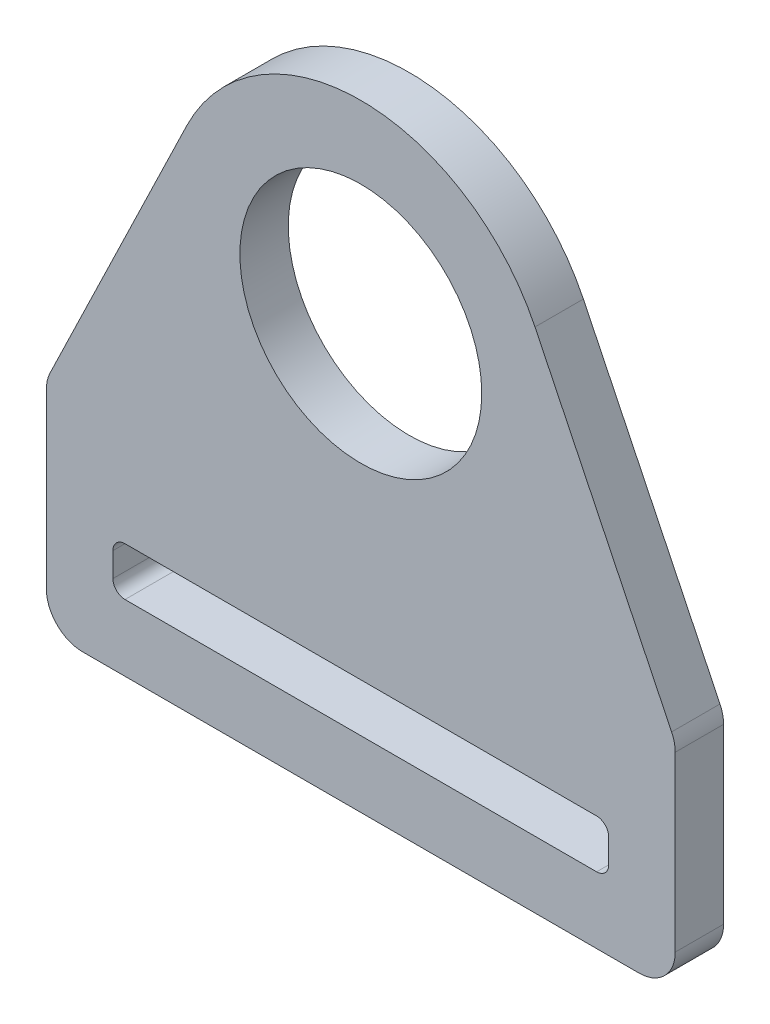
ISO-10303-21;
HEADER;
FILE_DESCRIPTION(('STEP AP214'),'2;1');
FILE_NAME('part.step','',(''),(''),'','','');
FILE_SCHEMA(('AUTOMOTIVE_DESIGN { 1 0 10303 214 1 1 1 1 }'));
ENDSEC;
DATA;
#1=APPLICATION_CONTEXT('core data for automotive mechanical design processes');
#2=APPLICATION_PROTOCOL_DEFINITION('international standard','automotive_design',2000,#1);
#3=PRODUCT_CONTEXT('',#1,'mechanical');
#4=PRODUCT('Part','Part','',(#3));
#5=PRODUCT_RELATED_PRODUCT_CATEGORY('part','',(#4));
#6=PRODUCT_DEFINITION_FORMATION('','',#4);
#7=PRODUCT_DEFINITION_CONTEXT('part definition',#1,'design');
#8=PRODUCT_DEFINITION('design','',#6,#7);
#9=PRODUCT_DEFINITION_SHAPE('','',#8);
#10=(LENGTH_UNIT() NAMED_UNIT(*) SI_UNIT(.MILLI.,.METRE.));
#11=(NAMED_UNIT(*) PLANE_ANGLE_UNIT() SI_UNIT($,.RADIAN.));
#12=(NAMED_UNIT(*) SI_UNIT($,.STERADIAN.) SOLID_ANGLE_UNIT());
#13=UNCERTAINTY_MEASURE_WITH_UNIT(LENGTH_MEASURE(1.E-05),#10,'distance_accuracy_value','');
#14=(GEOMETRIC_REPRESENTATION_CONTEXT(3) GLOBAL_UNCERTAINTY_ASSIGNED_CONTEXT((#13)) GLOBAL_UNIT_ASSIGNED_CONTEXT((#10,
#11,#12)) REPRESENTATION_CONTEXT('',''));
#15=CARTESIAN_POINT('',(0.,0.,0.));
#16=DIRECTION('',(0.,0.,1.));
#17=DIRECTION('',(1.,0.,0.));
#18=AXIS2_PLACEMENT_3D('',#15,#16,#17);
#19=CARTESIAN_POINT('',(0.,-25.5,4.));
#20=DIRECTION('',(0.,1.,0.));
#21=DIRECTION('',(0.,0.,1.));
#22=AXIS2_PLACEMENT_3D('',#19,#20,#21);
#23=PLANE('',#22);
#24=DIRECTION('',(1.,0.,0.));
#25=VECTOR('',#24,1.);
#26=CARTESIAN_POINT('',(0.,-25.5,0.));
#27=LINE('',#26,#25);
#28=CARTESIAN_POINT('',(-19.5,-25.5,0.));
#29=VERTEX_POINT('',#28);
#30=CARTESIAN_POINT('',(19.5,-25.5,0.));
#31=VERTEX_POINT('',#30);
#32=EDGE_CURVE('E233',#29,#31,#27,.T.);
#33=ORIENTED_EDGE('',*,*,#32,.T.);
#34=DIRECTION('',(0.,0.,-1.));
#35=VECTOR('',#34,1.);
#36=CARTESIAN_POINT('',(19.5,-25.5,4.));
#37=LINE('',#36,#35);
#38=CARTESIAN_POINT('',(19.5,-25.5,4.));
#39=VERTEX_POINT('',#38);
#40=EDGE_CURVE('E329',#31,#39,#37,.F.);
#41=ORIENTED_EDGE('',*,*,#40,.T.);
#42=DIRECTION('',(1.,0.,0.));
#43=VECTOR('',#42,1.);
#44=CARTESIAN_POINT('',(0.,-25.5,4.));
#45=LINE('',#44,#43);
#46=CARTESIAN_POINT('',(-19.5,-25.5,4.));
#47=VERTEX_POINT('',#46);
#48=EDGE_CURVE('E204',#47,#39,#45,.T.);
#49=ORIENTED_EDGE('',*,*,#48,.F.);
#50=DIRECTION('',(0.,0.,-1.));
#51=VECTOR('',#50,1.);
#52=CARTESIAN_POINT('',(-19.5,-25.5,4.));
#53=LINE('',#52,#51);
#54=EDGE_CURVE('E326',#47,#29,#53,.T.);
#55=ORIENTED_EDGE('',*,*,#54,.T.);
#56=EDGE_LOOP('',(#33,#41,#49,#55));
#57=FACE_BOUND('',#56,.T.);
#58=ADVANCED_FACE('F42',(#57),#23,.F.);
#59=CARTESIAN_POINT('',(20.5,0.,4.));
#60=DIRECTION('',(1.,0.,0.));
#61=DIRECTION('',(0.,0.,-1.));
#62=AXIS2_PLACEMENT_3D('',#59,#60,#61);
#63=PLANE('',#62);
#64=DIRECTION('',(0.,-1.,0.));
#65=VECTOR('',#64,1.);
#66=CARTESIAN_POINT('',(20.5,0.,0.));
#67=LINE('',#66,#65);
#68=CARTESIAN_POINT('',(20.5,-26.5,0.));
#69=VERTEX_POINT('',#68);
#70=CARTESIAN_POINT('',(20.5,-28.5,0.));
#71=VERTEX_POINT('',#70);
#72=EDGE_CURVE('E239',#69,#71,#67,.T.);
#73=ORIENTED_EDGE('',*,*,#72,.T.);
#74=DIRECTION('',(0.,0.,-1.));
#75=VECTOR('',#74,1.);
#76=CARTESIAN_POINT('',(20.5,-28.5,4.));
#77=LINE('',#76,#75);
#78=CARTESIAN_POINT('',(20.5,-28.5,4.));
#79=VERTEX_POINT('',#78);
#80=EDGE_CURVE('E324',#71,#79,#77,.F.);
#81=ORIENTED_EDGE('',*,*,#80,.T.);
#82=DIRECTION('',(0.,-1.,0.));
#83=VECTOR('',#82,1.);
#84=CARTESIAN_POINT('',(20.5,0.,4.));
#85=LINE('',#84,#83);
#86=CARTESIAN_POINT('',(20.5,-26.5,4.));
#87=VERTEX_POINT('',#86);
#88=EDGE_CURVE('E207',#87,#79,#85,.T.);
#89=ORIENTED_EDGE('',*,*,#88,.F.);
#90=DIRECTION('',(0.,0.,-1.));
#91=VECTOR('',#90,1.);
#92=CARTESIAN_POINT('',(20.5,-26.5,0.));
#93=LINE('',#92,#91);
#94=EDGE_CURVE('E321',#87,#69,#93,.T.);
#95=ORIENTED_EDGE('',*,*,#94,.T.);
#96=EDGE_LOOP('',(#73,#81,#89,#95));
#97=FACE_BOUND('',#96,.T.);
#98=ADVANCED_FACE('F353',(#97),#63,.F.);
#99=CARTESIAN_POINT('',(0.,-29.5,4.));
#100=DIRECTION('',(0.,1.,0.));
#101=DIRECTION('',(0.,0.,1.));
#102=AXIS2_PLACEMENT_3D('',#99,#100,#101);
#103=PLANE('',#102);
#104=DIRECTION('',(1.,0.,0.));
#105=VECTOR('',#104,1.);
#106=CARTESIAN_POINT('',(0.,-29.5,4.));
#107=LINE('',#106,#105);
#108=CARTESIAN_POINT('',(-19.5,-29.5,4.));
#109=VERTEX_POINT('',#108);
#110=CARTESIAN_POINT('',(19.5,-29.5,4.));
#111=VERTEX_POINT('',#110);
#112=EDGE_CURVE('E210',#109,#111,#107,.T.);
#113=ORIENTED_EDGE('',*,*,#112,.T.);
#114=DIRECTION('',(0.,0.,-1.));
#115=VECTOR('',#114,1.);
#116=CARTESIAN_POINT('',(19.5,-29.5,4.));
#117=LINE('',#116,#115);
#118=CARTESIAN_POINT('',(19.5,-29.5,0.));
#119=VERTEX_POINT('',#118);
#120=EDGE_CURVE('E318',#111,#119,#117,.T.);
#121=ORIENTED_EDGE('',*,*,#120,.T.);
#122=DIRECTION('',(1.,0.,0.));
#123=VECTOR('',#122,1.);
#124=CARTESIAN_POINT('',(0.,-29.5,0.));
#125=LINE('',#124,#123);
#126=CARTESIAN_POINT('',(-19.5,-29.5,0.));
#127=VERTEX_POINT('',#126);
#128=EDGE_CURVE('E247',#127,#119,#125,.T.);
#129=ORIENTED_EDGE('',*,*,#128,.F.);
#130=DIRECTION('',(0.,0.,-1.));
#131=VECTOR('',#130,1.);
#132=CARTESIAN_POINT('',(-19.5,-29.5,4.));
#133=LINE('',#132,#131);
#134=EDGE_CURVE('E316',#127,#109,#133,.F.);
#135=ORIENTED_EDGE('',*,*,#134,.T.);
#136=EDGE_LOOP('',(#113,#121,#129,#135));
#137=FACE_BOUND('',#136,.T.);
#138=ADVANCED_FACE('F348',(#137),#103,.T.);
#139=CARTESIAN_POINT('',(0.,-35.,4.));
#140=DIRECTION('',(0.,1.,0.));
#141=DIRECTION('',(0.,0.,1.));
#142=AXIS2_PLACEMENT_3D('',#139,#140,#141);
#143=PLANE('',#142);
#144=DIRECTION('',(1.,0.,0.));
#145=VECTOR('',#144,1.);
#146=CARTESIAN_POINT('',(0.,-35.,4.));
#147=LINE('',#146,#145);
#148=CARTESIAN_POINT('',(-23.,-35.,4.));
#149=VERTEX_POINT('',#148);
#150=CARTESIAN_POINT('',(23.,-35.,4.));
#151=VERTEX_POINT('',#150);
#152=EDGE_CURVE('E277',#149,#151,#147,.T.);
#153=ORIENTED_EDGE('',*,*,#152,.F.);
#154=DIRECTION('',(0.,0.,-1.));
#155=VECTOR('',#154,1.);
#156=CARTESIAN_POINT('',(-23.,-35.,0.));
#157=LINE('',#156,#155);
#158=CARTESIAN_POINT('',(-23.,-35.,0.));
#159=VERTEX_POINT('',#158);
#160=EDGE_CURVE('E306',#149,#159,#157,.T.);
#161=ORIENTED_EDGE('',*,*,#160,.T.);
#162=DIRECTION('',(1.,0.,0.));
#163=VECTOR('',#162,1.);
#164=CARTESIAN_POINT('',(0.,-35.,0.));
#165=LINE('',#164,#163);
#166=CARTESIAN_POINT('',(23.,-35.,0.));
#167=VERTEX_POINT('',#166);
#168=EDGE_CURVE('E218',#159,#167,#165,.T.);
#169=ORIENTED_EDGE('',*,*,#168,.T.);
#170=DIRECTION('',(0.,0.,-1.));
#171=VECTOR('',#170,1.);
#172=CARTESIAN_POINT('',(23.,-35.,4.));
#173=LINE('',#172,#171);
#174=EDGE_CURVE('E304',#167,#151,#173,.F.);
#175=ORIENTED_EDGE('',*,*,#174,.T.);
#176=EDGE_LOOP('',(#153,#161,#169,#175));
#177=FACE_BOUND('',#176,.T.);
#178=ADVANCED_FACE('F402',(#177),#143,.F.);
#179=CARTESIAN_POINT('',(26.,0.,4.));
#180=DIRECTION('',(-1.,0.,0.));
#181=DIRECTION('',(0.,-1.,0.));
#182=AXIS2_PLACEMENT_3D('',#179,#180,#181);
#183=PLANE('',#182);
#184=DIRECTION('',(0.,1.,0.));
#185=VECTOR('',#184,1.);
#186=CARTESIAN_POINT('',(26.,0.,0.));
#187=LINE('',#186,#185);
#188=CARTESIAN_POINT('',(26.,-32.,0.));
#189=VERTEX_POINT('',#188);
#190=CARTESIAN_POINT('',(26.,-17.6876467079563,0.));
#191=VERTEX_POINT('',#190);
#192=EDGE_CURVE('E223',#189,#191,#187,.T.);
#193=ORIENTED_EDGE('',*,*,#192,.T.);
#194=DIRECTION('',(0.,0.,-1.));
#195=VECTOR('',#194,1.);
#196=CARTESIAN_POINT('',(26.,-17.6876467079563,4.));
#197=LINE('',#196,#195);
#198=CARTESIAN_POINT('',(26.,-17.6876467079563,4.));
#199=VERTEX_POINT('',#198);
#200=EDGE_CURVE('E314',#191,#199,#197,.F.);
#201=ORIENTED_EDGE('',*,*,#200,.T.);
#202=DIRECTION('',(0.,1.,0.));
#203=VECTOR('',#202,1.);
#204=CARTESIAN_POINT('',(26.,0.,4.));
#205=LINE('',#204,#203);
#206=CARTESIAN_POINT('',(26.,-32.,4.));
#207=VERTEX_POINT('',#206);
#208=EDGE_CURVE('E181',#207,#199,#205,.T.);
#209=ORIENTED_EDGE('',*,*,#208,.F.);
#210=DIRECTION('',(0.,0.,-1.));
#211=VECTOR('',#210,1.);
#212=CARTESIAN_POINT('',(26.,-32.,4.));
#213=LINE('',#212,#211);
#214=EDGE_CURVE('E311',#207,#189,#213,.T.);
#215=ORIENTED_EDGE('',*,*,#214,.T.);
#216=EDGE_LOOP('',(#193,#201,#209,#215));
#217=FACE_BOUND('',#216,.T.);
#218=ADVANCED_FACE('F399',(#217),#183,.F.);
#219=CARTESIAN_POINT('',(14.402651465179,6.9687610643914,4.));
#220=DIRECTION('',(-0.900165716573687,-0.435547566524462,0.));
#221=DIRECTION('',(0.435547566524462,-0.900165716573687,0.));
#222=AXIS2_PLACEMENT_3D('',#219,#220,#221);
#223=PLANE('',#222);
#224=DIRECTION('',(-0.435547566524462,0.900165716573687,0.));
#225=VECTOR('',#224,1.);
#226=CARTESIAN_POINT('',(14.402651465179,6.9687610643914,4.));
#227=LINE('',#226,#225);
#228=CARTESIAN_POINT('',(25.7004971497211,-16.381004008383,4.));
#229=VERTEX_POINT('',#228);
#230=CARTESIAN_POINT('',(14.402651465179,6.9687610643914,4.));
#231=VERTEX_POINT('',#230);
#232=EDGE_CURVE('E168',#229,#231,#227,.T.);
#233=ORIENTED_EDGE('',*,*,#232,.F.);
#234=DIRECTION('',(0.,0.,-1.));
#235=VECTOR('',#234,1.);
#236=CARTESIAN_POINT('',(25.7004971497211,-16.381004008383,4.));
#237=LINE('',#236,#235);
#238=CARTESIAN_POINT('',(25.7004971497211,-16.381004008383,0.));
#239=VERTEX_POINT('',#238);
#240=EDGE_CURVE('E309',#229,#239,#237,.T.);
#241=ORIENTED_EDGE('',*,*,#240,.T.);
#242=DIRECTION('',(-0.435547566524462,0.900165716573687,0.));
#243=VECTOR('',#242,1.);
#244=CARTESIAN_POINT('',(14.402651465179,6.9687610643914,0.));
#245=LINE('',#244,#243);
#246=CARTESIAN_POINT('',(14.402651465179,6.9687610643914,0.));
#247=VERTEX_POINT('',#246);
#248=EDGE_CURVE('E187',#239,#247,#245,.T.);
#249=ORIENTED_EDGE('',*,*,#248,.T.);
#250=DIRECTION('',(0.,0.,-1.));
#251=VECTOR('',#250,1.);
#252=CARTESIAN_POINT('',(14.402651465179,6.9687610643914,4.));
#253=LINE('',#252,#251);
#254=EDGE_CURVE('E184',#231,#247,#253,.T.);
#255=ORIENTED_EDGE('',*,*,#254,.F.);
#256=EDGE_LOOP('',(#233,#241,#249,#255));
#257=FACE_BOUND('',#256,.T.);
#258=ADVANCED_FACE('F185',(#257),#223,.F.);
#259=CARTESIAN_POINT('',(0.,0.,4.));
#260=DIRECTION('',(0.,0.,-1.));
#261=DIRECTION('',(-1.,0.,0.));
#262=AXIS2_PLACEMENT_3D('',#259,#260,#261);
#263=CYLINDRICAL_SURFACE('',#262,16.);
#264=CARTESIAN_POINT('',(0.,0.,0.));
#265=DIRECTION('',(0.,0.,1.));
#266=DIRECTION('',(1.,0.,0.));
#267=AXIS2_PLACEMENT_3D('',#264,#265,#266);
#268=CIRCLE('',#267,16.);
#269=CARTESIAN_POINT('',(-14.402651465179,6.96876106439139,0.));
#270=VERTEX_POINT('',#269);
#271=EDGE_CURVE('E569',#247,#270,#268,.T.);
#272=ORIENTED_EDGE('',*,*,#271,.T.);
#273=DIRECTION('',(0.,0.,-1.));
#274=VECTOR('',#273,1.);
#275=CARTESIAN_POINT('',(-14.402651465179,6.96876106439139,4.));
#276=LINE('',#275,#274);
#277=CARTESIAN_POINT('',(-14.402651465179,6.96876106439139,4.));
#278=VERTEX_POINT('',#277);
#279=EDGE_CURVE('E192',#278,#270,#276,.T.);
#280=ORIENTED_EDGE('',*,*,#279,.F.);
#281=CARTESIAN_POINT('',(0.,0.,4.));
#282=DIRECTION('',(0.,0.,1.));
#283=DIRECTION('',(1.,0.,0.));
#284=AXIS2_PLACEMENT_3D('',#281,#282,#283);
#285=CIRCLE('',#284,16.);
#286=EDGE_CURVE('E173',#231,#278,#285,.T.);
#287=ORIENTED_EDGE('',*,*,#286,.F.);
#288=ORIENTED_EDGE('',*,*,#254,.T.);
#289=EDGE_LOOP('',(#272,#280,#287,#288));
#290=FACE_BOUND('',#289,.T.);
#291=ADVANCED_FACE('F194',(#290),#263,.T.);
#292=CARTESIAN_POINT('',(-14.402651465179,6.96876106439139,4.));
#293=DIRECTION('',(-0.900165716573687,0.435547566524462,0.));
#294=DIRECTION('',(-0.435547566524462,-0.900165716573687,0.));
#295=AXIS2_PLACEMENT_3D('',#292,#293,#294);
#296=PLANE('',#295);
#297=DIRECTION('',(0.435547566524462,0.900165716573687,0.));
#298=VECTOR('',#297,1.);
#299=CARTESIAN_POINT('',(-14.402651465179,6.96876106439139,0.));
#300=LINE('',#299,#298);
#301=CARTESIAN_POINT('',(-25.7004971497211,-16.381004008383,0.));
#302=VERTEX_POINT('',#301);
#303=EDGE_CURVE('E567',#302,#270,#300,.T.);
#304=ORIENTED_EDGE('',*,*,#303,.F.);
#305=DIRECTION('',(0.,0.,-1.));
#306=VECTOR('',#305,1.);
#307=CARTESIAN_POINT('',(-25.7004971497211,-16.3810040083829,4.));
#308=LINE('',#307,#306);
#309=CARTESIAN_POINT('',(-25.7004971497211,-16.381004008383,4.));
#310=VERTEX_POINT('',#309);
#311=EDGE_CURVE('E295',#302,#310,#308,.F.);
#312=ORIENTED_EDGE('',*,*,#311,.T.);
#313=DIRECTION('',(0.435547566524462,0.900165716573687,0.));
#314=VECTOR('',#313,1.);
#315=CARTESIAN_POINT('',(-14.402651465179,6.96876106439139,4.));
#316=LINE('',#315,#314);
#317=EDGE_CURVE('E196',#310,#278,#316,.T.);
#318=ORIENTED_EDGE('',*,*,#317,.T.);
#319=ORIENTED_EDGE('',*,*,#279,.T.);
#320=EDGE_LOOP('',(#304,#312,#318,#319));
#321=FACE_BOUND('',#320,.T.);
#322=ADVANCED_FACE('F375',(#321),#296,.T.);
#323=CARTESIAN_POINT('',(-20.5,0.,4.));
#324=DIRECTION('',(1.,0.,0.));
#325=DIRECTION('',(0.,0.,-1.));
#326=AXIS2_PLACEMENT_3D('',#323,#324,#325);
#327=PLANE('',#326);
#328=DIRECTION('',(0.,-1.,0.));
#329=VECTOR('',#328,1.);
#330=CARTESIAN_POINT('',(-20.5,0.,4.));
#331=LINE('',#330,#329);
#332=CARTESIAN_POINT('',(-20.5,-26.5,4.));
#333=VERTEX_POINT('',#332);
#334=CARTESIAN_POINT('',(-20.5,-28.5,4.));
#335=VERTEX_POINT('',#334);
#336=EDGE_CURVE('E213',#333,#335,#331,.T.);
#337=ORIENTED_EDGE('',*,*,#336,.T.);
#338=DIRECTION('',(0.,0.,-1.));
#339=VECTOR('',#338,1.);
#340=CARTESIAN_POINT('',(-20.5,-28.5,0.));
#341=LINE('',#340,#339);
#342=CARTESIAN_POINT('',(-20.5,-28.5,0.));
#343=VERTEX_POINT('',#342);
#344=EDGE_CURVE('E332',#335,#343,#341,.T.);
#345=ORIENTED_EDGE('',*,*,#344,.T.);
#346=DIRECTION('',(0.,-1.,0.));
#347=VECTOR('',#346,1.);
#348=CARTESIAN_POINT('',(-20.5,0.,0.));
#349=LINE('',#348,#347);
#350=CARTESIAN_POINT('',(-20.5,-26.5,0.));
#351=VERTEX_POINT('',#350);
#352=EDGE_CURVE('E268',#351,#343,#349,.T.);
#353=ORIENTED_EDGE('',*,*,#352,.F.);
#354=DIRECTION('',(0.,0.,-1.));
#355=VECTOR('',#354,1.);
#356=CARTESIAN_POINT('',(-20.5,-26.5,4.));
#357=LINE('',#356,#355);
#358=EDGE_CURVE('E64',#351,#333,#357,.F.);
#359=ORIENTED_EDGE('',*,*,#358,.T.);
#360=EDGE_LOOP('',(#337,#345,#353,#359));
#361=FACE_BOUND('',#360,.T.);
#362=ADVANCED_FACE('F372',(#361),#327,.T.);
#363=CARTESIAN_POINT('',(-26.,0.,4.));
#364=DIRECTION('',(-1.,0.,0.));
#365=DIRECTION('',(0.,-1.,0.));
#366=AXIS2_PLACEMENT_3D('',#363,#364,#365);
#367=PLANE('',#366);
#368=DIRECTION('',(0.,1.,0.));
#369=VECTOR('',#368,1.);
#370=CARTESIAN_POINT('',(-26.,0.,4.));
#371=LINE('',#370,#369);
#372=CARTESIAN_POINT('',(-26.,-32.,4.));
#373=VERTEX_POINT('',#372);
#374=CARTESIAN_POINT('',(-26.,-17.6876467079563,4.));
#375=VERTEX_POINT('',#374);
#376=EDGE_CURVE('E198',#373,#375,#371,.T.);
#377=ORIENTED_EDGE('',*,*,#376,.T.);
#378=DIRECTION('',(0.,0.,-1.));
#379=VECTOR('',#378,1.);
#380=CARTESIAN_POINT('',(-26.,-17.6876467079563,4.));
#381=LINE('',#380,#379);
#382=CARTESIAN_POINT('',(-26.,-17.6876467079563,0.));
#383=VERTEX_POINT('',#382);
#384=EDGE_CURVE('E280',#375,#383,#381,.T.);
#385=ORIENTED_EDGE('',*,*,#384,.T.);
#386=DIRECTION('',(0.,1.,0.));
#387=VECTOR('',#386,1.);
#388=CARTESIAN_POINT('',(-26.,0.,0.));
#389=LINE('',#388,#387);
#390=CARTESIAN_POINT('',(-26.,-32.,0.));
#391=VERTEX_POINT('',#390);
#392=EDGE_CURVE('E240',#391,#383,#389,.T.);
#393=ORIENTED_EDGE('',*,*,#392,.F.);
#394=DIRECTION('',(0.,0.,-1.));
#395=VECTOR('',#394,1.);
#396=CARTESIAN_POINT('',(-26.,-32.,4.));
#397=LINE('',#396,#395);
#398=EDGE_CURVE('E191',#391,#373,#397,.F.);
#399=ORIENTED_EDGE('',*,*,#398,.T.);
#400=EDGE_LOOP('',(#377,#385,#393,#399));
#401=FACE_BOUND('',#400,.T.);
#402=ADVANCED_FACE('F374',(#401),#367,.T.);
#403=CARTESIAN_POINT('',(0.,0.,4.));
#404=DIRECTION('',(0.,0.,-1.));
#405=DIRECTION('',(-1.,0.,0.));
#406=AXIS2_PLACEMENT_3D('',#403,#404,#405);
#407=CYLINDRICAL_SURFACE('',#406,10.);
#408=CARTESIAN_POINT('',(0.,0.,4.));
#409=DIRECTION('',(0.,0.,1.));
#410=DIRECTION('',(1.,0.,0.));
#411=AXIS2_PLACEMENT_3D('',#408,#409,#410);
#412=CIRCLE('',#411,10.);
#413=CARTESIAN_POINT('',(10.,0.,4.));
#414=VERTEX_POINT('',#413);
#415=EDGE_CURVE('E215',#414,#414,#412,.T.);
#416=ORIENTED_EDGE('',*,*,#415,.T.);
#417=EDGE_LOOP('',(#416));
#418=FACE_BOUND('',#417,.T.);
#419=CARTESIAN_POINT('',(0.,0.,0.));
#420=DIRECTION('',(0.,0.,1.));
#421=DIRECTION('',(1.,0.,0.));
#422=AXIS2_PLACEMENT_3D('',#419,#420,#421);
#423=CIRCLE('',#422,10.);
#424=CARTESIAN_POINT('',(10.,0.,0.));
#425=VERTEX_POINT('',#424);
#426=EDGE_CURVE('E272',#425,#425,#423,.T.);
#427=ORIENTED_EDGE('',*,*,#426,.F.);
#428=EDGE_LOOP('',(#427));
#429=FACE_BOUND('',#428,.T.);
#430=ADVANCED_FACE('F381',(#418,#429),#407,.F.);
#431=CARTESIAN_POINT('',(0.,0.,4.));
#432=DIRECTION('',(0.,0.,1.));
#433=DIRECTION('',(1.,0.,0.));
#434=AXIS2_PLACEMENT_3D('',#431,#432,#433);
#435=PLANE('',#434);
#436=ORIENTED_EDGE('',*,*,#317,.F.);
#437=CARTESIAN_POINT('',(-23.,-17.6876467079563,4.));
#438=DIRECTION('',(0.,0.,1.));
#439=DIRECTION('',(1.,0.,0.));
#440=AXIS2_PLACEMENT_3D('',#437,#438,#439);
#441=CIRCLE('',#440,3.);
#442=EDGE_CURVE('E302',#310,#375,#441,.T.);
#443=ORIENTED_EDGE('',*,*,#442,.T.);
#444=ORIENTED_EDGE('',*,*,#376,.F.);
#445=CARTESIAN_POINT('',(-23.,-32.,4.));
#446=DIRECTION('',(0.,0.,1.));
#447=DIRECTION('',(1.,0.,0.));
#448=AXIS2_PLACEMENT_3D('',#445,#446,#447);
#449=CIRCLE('',#448,3.);
#450=EDGE_CURVE('E300',#373,#149,#449,.T.);
#451=ORIENTED_EDGE('',*,*,#450,.T.);
#452=ORIENTED_EDGE('',*,*,#152,.T.);
#453=CARTESIAN_POINT('',(23.,-32.,4.));
#454=DIRECTION('',(0.,0.,1.));
#455=DIRECTION('',(1.,0.,0.));
#456=AXIS2_PLACEMENT_3D('',#453,#454,#455);
#457=CIRCLE('',#456,3.);
#458=EDGE_CURVE('E297',#151,#207,#457,.T.);
#459=ORIENTED_EDGE('',*,*,#458,.T.);
#460=ORIENTED_EDGE('',*,*,#208,.T.);
#461=CARTESIAN_POINT('',(23.,-17.6876467079563,4.));
#462=DIRECTION('',(0.,0.,1.));
#463=DIRECTION('',(1.,0.,0.));
#464=AXIS2_PLACEMENT_3D('',#461,#462,#463);
#465=CIRCLE('',#464,3.);
#466=EDGE_CURVE('E177',#199,#229,#465,.T.);
#467=ORIENTED_EDGE('',*,*,#466,.T.);
#468=ORIENTED_EDGE('',*,*,#232,.T.);
#469=ORIENTED_EDGE('',*,*,#286,.T.);
#470=EDGE_LOOP('',(#436,#443,#444,#451,#452,#459,#460,#467,#468,#469));
#471=FACE_BOUND('',#470,.T.);
#472=ORIENTED_EDGE('',*,*,#336,.F.);
#473=CARTESIAN_POINT('',(-19.5,-26.5,4.));
#474=DIRECTION('',(0.,0.,1.));
#475=DIRECTION('',(1.,0.,0.));
#476=AXIS2_PLACEMENT_3D('',#473,#474,#475);
#477=CIRCLE('',#476,1.);
#478=EDGE_CURVE('E12',#333,#47,#477,.F.);
#479=ORIENTED_EDGE('',*,*,#478,.T.);
#480=ORIENTED_EDGE('',*,*,#48,.T.);
#481=CARTESIAN_POINT('',(19.5,-26.5,4.));
#482=DIRECTION('',(0.,0.,1.));
#483=DIRECTION('',(1.,0.,0.));
#484=AXIS2_PLACEMENT_3D('',#481,#482,#483);
#485=CIRCLE('',#484,1.);
#486=EDGE_CURVE('E260',#39,#87,#485,.F.);
#487=ORIENTED_EDGE('',*,*,#486,.T.);
#488=ORIENTED_EDGE('',*,*,#88,.T.);
#489=CARTESIAN_POINT('',(19.5,-28.5,4.));
#490=DIRECTION('',(0.,0.,1.));
#491=DIRECTION('',(1.,0.,0.));
#492=AXIS2_PLACEMENT_3D('',#489,#490,#491);
#493=CIRCLE('',#492,1.);
#494=EDGE_CURVE('E261',#79,#111,#493,.F.);
#495=ORIENTED_EDGE('',*,*,#494,.T.);
#496=ORIENTED_EDGE('',*,*,#112,.F.);
#497=CARTESIAN_POINT('',(-19.5,-28.5,4.));
#498=DIRECTION('',(0.,0.,1.));
#499=DIRECTION('',(1.,0.,0.));
#500=AXIS2_PLACEMENT_3D('',#497,#498,#499);
#501=CIRCLE('',#500,1.);
#502=EDGE_CURVE('E57',#109,#335,#501,.F.);
#503=ORIENTED_EDGE('',*,*,#502,.T.);
#504=EDGE_LOOP('',(#472,#479,#480,#487,#488,#495,#496,#503));
#505=FACE_BOUND('',#504,.T.);
#506=ORIENTED_EDGE('',*,*,#415,.F.);
#507=EDGE_LOOP('',(#506));
#508=FACE_BOUND('',#507,.T.);
#509=ADVANCED_FACE('F171',(#471,#505,#508),#435,.T.);
#510=CARTESIAN_POINT('',(0.,0.,0.));
#511=DIRECTION('',(0.,0.,1.));
#512=DIRECTION('',(1.,0.,0.));
#513=AXIS2_PLACEMENT_3D('',#510,#511,#512);
#514=PLANE('',#513);
#515=ORIENTED_EDGE('',*,*,#392,.T.);
#516=CARTESIAN_POINT('',(-23.,-17.6876467079563,0.));
#517=DIRECTION('',(0.,0.,1.));
#518=DIRECTION('',(1.,0.,0.));
#519=AXIS2_PLACEMENT_3D('',#516,#517,#518);
#520=CIRCLE('',#519,3.);
#521=EDGE_CURVE('E292',#383,#302,#520,.F.);
#522=ORIENTED_EDGE('',*,*,#521,.T.);
#523=ORIENTED_EDGE('',*,*,#303,.T.);
#524=ORIENTED_EDGE('',*,*,#271,.F.);
#525=ORIENTED_EDGE('',*,*,#248,.F.);
#526=CARTESIAN_POINT('',(23.,-17.6876467079563,0.));
#527=DIRECTION('',(0.,0.,1.));
#528=DIRECTION('',(1.,0.,0.));
#529=AXIS2_PLACEMENT_3D('',#526,#527,#528);
#530=CIRCLE('',#529,3.);
#531=EDGE_CURVE('E286',#239,#191,#530,.F.);
#532=ORIENTED_EDGE('',*,*,#531,.T.);
#533=ORIENTED_EDGE('',*,*,#192,.F.);
#534=CARTESIAN_POINT('',(23.,-32.,0.));
#535=DIRECTION('',(0.,0.,1.));
#536=DIRECTION('',(1.,0.,0.));
#537=AXIS2_PLACEMENT_3D('',#534,#535,#536);
#538=CIRCLE('',#537,3.);
#539=EDGE_CURVE('E283',#189,#167,#538,.F.);
#540=ORIENTED_EDGE('',*,*,#539,.T.);
#541=ORIENTED_EDGE('',*,*,#168,.F.);
#542=CARTESIAN_POINT('',(-23.,-32.,0.));
#543=DIRECTION('',(0.,0.,1.));
#544=DIRECTION('',(1.,0.,0.));
#545=AXIS2_PLACEMENT_3D('',#542,#543,#544);
#546=CIRCLE('',#545,3.);
#547=EDGE_CURVE('E289',#159,#391,#546,.F.);
#548=ORIENTED_EDGE('',*,*,#547,.T.);
#549=EDGE_LOOP('',(#515,#522,#523,#524,#525,#532,#533,#540,#541,#548));
#550=FACE_BOUND('',#549,.T.);
#551=ORIENTED_EDGE('',*,*,#32,.F.);
#552=CARTESIAN_POINT('',(-19.5,-26.5,0.));
#553=DIRECTION('',(0.,0.,1.));
#554=DIRECTION('',(1.,0.,0.));
#555=AXIS2_PLACEMENT_3D('',#552,#553,#554);
#556=CIRCLE('',#555,1.);
#557=EDGE_CURVE('E50',#29,#351,#556,.T.);
#558=ORIENTED_EDGE('',*,*,#557,.T.);
#559=ORIENTED_EDGE('',*,*,#352,.T.);
#560=CARTESIAN_POINT('',(-19.5,-28.5,0.));
#561=DIRECTION('',(0.,0.,1.));
#562=DIRECTION('',(1.,0.,0.));
#563=AXIS2_PLACEMENT_3D('',#560,#561,#562);
#564=CIRCLE('',#563,1.);
#565=EDGE_CURVE('E263',#343,#127,#564,.T.);
#566=ORIENTED_EDGE('',*,*,#565,.T.);
#567=ORIENTED_EDGE('',*,*,#128,.T.);
#568=CARTESIAN_POINT('',(19.5,-28.5,0.));
#569=DIRECTION('',(0.,0.,1.));
#570=DIRECTION('',(1.,0.,0.));
#571=AXIS2_PLACEMENT_3D('',#568,#569,#570);
#572=CIRCLE('',#571,1.);
#573=EDGE_CURVE('E334',#119,#71,#572,.T.);
#574=ORIENTED_EDGE('',*,*,#573,.T.);
#575=ORIENTED_EDGE('',*,*,#72,.F.);
#576=CARTESIAN_POINT('',(19.5,-26.5,0.));
#577=DIRECTION('',(0.,0.,1.));
#578=DIRECTION('',(1.,0.,0.));
#579=AXIS2_PLACEMENT_3D('',#576,#577,#578);
#580=CIRCLE('',#579,1.);
#581=EDGE_CURVE('E255',#69,#31,#580,.T.);
#582=ORIENTED_EDGE('',*,*,#581,.T.);
#583=EDGE_LOOP('',(#551,#558,#559,#566,#567,#574,#575,#582));
#584=FACE_BOUND('',#583,.T.);
#585=ORIENTED_EDGE('',*,*,#426,.T.);
#586=EDGE_LOOP('',(#585));
#587=FACE_BOUND('',#586,.T.);
#588=ADVANCED_FACE('F356',(#550,#584,#587),#514,.F.);
#589=CARTESIAN_POINT('',(-23.,-17.6876467079563,4.));
#590=DIRECTION('',(0.,0.,-1.));
#591=DIRECTION('',(-1.,0.,0.));
#592=AXIS2_PLACEMENT_3D('',#589,#590,#591);
#593=CYLINDRICAL_SURFACE('',#592,3.);
#594=ORIENTED_EDGE('',*,*,#442,.F.);
#595=ORIENTED_EDGE('',*,*,#311,.F.);
#596=ORIENTED_EDGE('',*,*,#521,.F.);
#597=ORIENTED_EDGE('',*,*,#384,.F.);
#598=EDGE_LOOP('',(#594,#595,#596,#597));
#599=FACE_BOUND('',#598,.T.);
#600=ADVANCED_FACE('F407',(#599),#593,.T.);
#601=CARTESIAN_POINT('',(-23.,-32.,4.));
#602=DIRECTION('',(0.,0.,1.));
#603=DIRECTION('',(1.,0.,0.));
#604=AXIS2_PLACEMENT_3D('',#601,#602,#603);
#605=CYLINDRICAL_SURFACE('',#604,3.);
#606=ORIENTED_EDGE('',*,*,#450,.F.);
#607=ORIENTED_EDGE('',*,*,#398,.F.);
#608=ORIENTED_EDGE('',*,*,#547,.F.);
#609=ORIENTED_EDGE('',*,*,#160,.F.);
#610=EDGE_LOOP('',(#606,#607,#608,#609));
#611=FACE_BOUND('',#610,.T.);
#612=ADVANCED_FACE('F410',(#611),#605,.T.);
#613=CARTESIAN_POINT('',(23.,-17.6876467079563,4.));
#614=DIRECTION('',(0.,0.,-1.));
#615=DIRECTION('',(-1.,0.,0.));
#616=AXIS2_PLACEMENT_3D('',#613,#614,#615);
#617=CYLINDRICAL_SURFACE('',#616,3.);
#618=ORIENTED_EDGE('',*,*,#466,.F.);
#619=ORIENTED_EDGE('',*,*,#200,.F.);
#620=ORIENTED_EDGE('',*,*,#531,.F.);
#621=ORIENTED_EDGE('',*,*,#240,.F.);
#622=EDGE_LOOP('',(#618,#619,#620,#621));
#623=FACE_BOUND('',#622,.T.);
#624=ADVANCED_FACE('F414',(#623),#617,.T.);
#625=CARTESIAN_POINT('',(23.,-32.,4.));
#626=DIRECTION('',(0.,0.,-1.));
#627=DIRECTION('',(-1.,0.,0.));
#628=AXIS2_PLACEMENT_3D('',#625,#626,#627);
#629=CYLINDRICAL_SURFACE('',#628,3.);
#630=ORIENTED_EDGE('',*,*,#458,.F.);
#631=ORIENTED_EDGE('',*,*,#174,.F.);
#632=ORIENTED_EDGE('',*,*,#539,.F.);
#633=ORIENTED_EDGE('',*,*,#214,.F.);
#634=EDGE_LOOP('',(#630,#631,#632,#633));
#635=FACE_BOUND('',#634,.T.);
#636=ADVANCED_FACE('F418',(#635),#629,.T.);
#637=CARTESIAN_POINT('',(19.5,-28.5,4.));
#638=DIRECTION('',(0.,0.,-1.));
#639=DIRECTION('',(-1.,0.,0.));
#640=AXIS2_PLACEMENT_3D('',#637,#638,#639);
#641=CYLINDRICAL_SURFACE('',#640,1.);
#642=ORIENTED_EDGE('',*,*,#494,.F.);
#643=ORIENTED_EDGE('',*,*,#80,.F.);
#644=ORIENTED_EDGE('',*,*,#573,.F.);
#645=ORIENTED_EDGE('',*,*,#120,.F.);
#646=EDGE_LOOP('',(#642,#643,#644,#645));
#647=FACE_BOUND('',#646,.T.);
#648=ADVANCED_FACE('F351',(#647),#641,.F.);
#649=CARTESIAN_POINT('',(19.5,-26.5,4.));
#650=DIRECTION('',(0.,0.,1.));
#651=DIRECTION('',(1.,0.,0.));
#652=AXIS2_PLACEMENT_3D('',#649,#650,#651);
#653=CYLINDRICAL_SURFACE('',#652,1.);
#654=ORIENTED_EDGE('',*,*,#486,.F.);
#655=ORIENTED_EDGE('',*,*,#40,.F.);
#656=ORIENTED_EDGE('',*,*,#581,.F.);
#657=ORIENTED_EDGE('',*,*,#94,.F.);
#658=EDGE_LOOP('',(#654,#655,#656,#657));
#659=FACE_BOUND('',#658,.T.);
#660=ADVANCED_FACE('F364',(#659),#653,.F.);
#661=CARTESIAN_POINT('',(-19.5,-28.5,4.));
#662=DIRECTION('',(0.,0.,1.));
#663=DIRECTION('',(1.,0.,0.));
#664=AXIS2_PLACEMENT_3D('',#661,#662,#663);
#665=CYLINDRICAL_SURFACE('',#664,1.);
#666=ORIENTED_EDGE('',*,*,#502,.F.);
#667=ORIENTED_EDGE('',*,*,#134,.F.);
#668=ORIENTED_EDGE('',*,*,#565,.F.);
#669=ORIENTED_EDGE('',*,*,#344,.F.);
#670=EDGE_LOOP('',(#666,#667,#668,#669));
#671=FACE_BOUND('',#670,.T.);
#672=ADVANCED_FACE('F370',(#671),#665,.F.);
#673=CARTESIAN_POINT('',(-19.5,-26.5,4.));
#674=DIRECTION('',(0.,0.,-1.));
#675=DIRECTION('',(-1.,0.,0.));
#676=AXIS2_PLACEMENT_3D('',#673,#674,#675);
#677=CYLINDRICAL_SURFACE('',#676,1.);
#678=ORIENTED_EDGE('',*,*,#478,.F.);
#679=ORIENTED_EDGE('',*,*,#358,.F.);
#680=ORIENTED_EDGE('',*,*,#557,.F.);
#681=ORIENTED_EDGE('',*,*,#54,.F.);
#682=EDGE_LOOP('',(#678,#679,#680,#681));
#683=FACE_BOUND('',#682,.T.);
#684=ADVANCED_FACE('F44',(#683),#677,.F.);
#685=CLOSED_SHELL('',(#58,#98,#138,#178,#218,#258,#291,#322,#362,#402,#430,#509,#588,#600,#612,
#624,#636,#648,#660,#672,#684));
#686=MANIFOLD_SOLID_BREP('B2',#685);
#687=ADVANCED_BREP_SHAPE_REPRESENTATION('',(#18,#686),#14);
#688=SHAPE_DEFINITION_REPRESENTATION(#9,#687);
ENDSEC;
END-ISO-10303-21;
